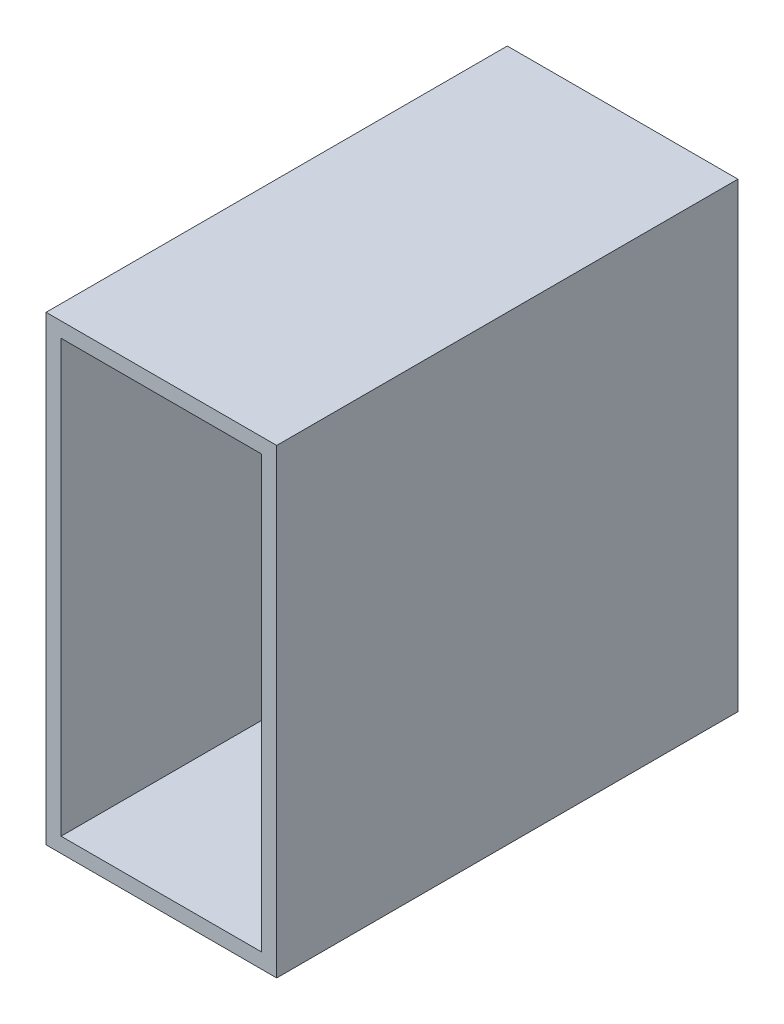
ISO-10303-21;
HEADER;
FILE_DESCRIPTION(('STEP AP214'),'2;1');
FILE_NAME('part.step','',(''),(''),'','','');
FILE_SCHEMA(('AUTOMOTIVE_DESIGN { 1 0 10303 214 1 1 1 1 }'));
ENDSEC;
DATA;
#1=APPLICATION_CONTEXT('core data for automotive mechanical design processes');
#2=APPLICATION_PROTOCOL_DEFINITION('international standard','automotive_design',2000,#1);
#3=PRODUCT_CONTEXT('',#1,'mechanical');
#4=PRODUCT('Part','Part','',(#3));
#5=PRODUCT_RELATED_PRODUCT_CATEGORY('part','',(#4));
#6=PRODUCT_DEFINITION_FORMATION('','',#4);
#7=PRODUCT_DEFINITION_CONTEXT('part definition',#1,'design');
#8=PRODUCT_DEFINITION('design','',#6,#7);
#9=PRODUCT_DEFINITION_SHAPE('','',#8);
#10=(LENGTH_UNIT() NAMED_UNIT(*) SI_UNIT(.MILLI.,.METRE.));
#11=(NAMED_UNIT(*) PLANE_ANGLE_UNIT() SI_UNIT($,.RADIAN.));
#12=(NAMED_UNIT(*) SI_UNIT($,.STERADIAN.) SOLID_ANGLE_UNIT());
#13=UNCERTAINTY_MEASURE_WITH_UNIT(LENGTH_MEASURE(1.E-05),#10,'distance_accuracy_value','');
#14=(GEOMETRIC_REPRESENTATION_CONTEXT(3) GLOBAL_UNCERTAINTY_ASSIGNED_CONTEXT((#13)) GLOBAL_UNIT_ASSIGNED_CONTEXT((#10,
#11,#12)) REPRESENTATION_CONTEXT('',''));
#15=CARTESIAN_POINT('',(0.,0.,0.));
#16=DIRECTION('',(0.,0.,1.));
#17=DIRECTION('',(1.,0.,0.));
#18=AXIS2_PLACEMENT_3D('',#15,#16,#17);
#19=CARTESIAN_POINT('',(-48.4372093023255,-30.1994186046511,50.8));
#20=DIRECTION('',(1.,0.,0.));
#21=DIRECTION('',(0.,0.,-1.));
#22=AXIS2_PLACEMENT_3D('',#19,#20,#21);
#23=PLANE('',#22);
#24=DIRECTION('',(0.,-1.,0.));
#25=VECTOR('',#24,1.);
#26=CARTESIAN_POINT('',(-48.4372093023255,-30.1994186046511,0.));
#27=LINE('',#26,#25);
#28=CARTESIAN_POINT('',(-48.4372093023255,20.6005813953489,0.));
#29=VERTEX_POINT('',#28);
#30=CARTESIAN_POINT('',(-48.4372093023255,-30.1994186046511,0.));
#31=VERTEX_POINT('',#30);
#32=EDGE_CURVE('E130',#29,#31,#27,.T.);
#33=ORIENTED_EDGE('',*,*,#32,.T.);
#34=DIRECTION('',(0.,0.,-1.));
#35=VECTOR('',#34,1.);
#36=CARTESIAN_POINT('',(-48.4372093023255,-30.1994186046511,50.8));
#37=LINE('',#36,#35);
#38=CARTESIAN_POINT('',(-48.4372093023255,-30.1994186046511,50.8));
#39=VERTEX_POINT('',#38);
#40=EDGE_CURVE('E11',#39,#31,#37,.T.);
#41=ORIENTED_EDGE('',*,*,#40,.F.);
#42=DIRECTION('',(0.,-1.,0.));
#43=VECTOR('',#42,1.);
#44=CARTESIAN_POINT('',(-48.4372093023255,-30.1994186046511,50.8));
#45=LINE('',#44,#43);
#46=CARTESIAN_POINT('',(-48.4372093023255,20.6005813953489,50.8));
#47=VERTEX_POINT('',#46);
#48=EDGE_CURVE('E134',#47,#39,#45,.T.);
#49=ORIENTED_EDGE('',*,*,#48,.F.);
#50=DIRECTION('',(0.,0.,-1.));
#51=VECTOR('',#50,1.);
#52=CARTESIAN_POINT('',(-48.4372093023255,20.6005813953489,50.8));
#53=LINE('',#52,#51);
#54=EDGE_CURVE('E144',#47,#29,#53,.T.);
#55=ORIENTED_EDGE('',*,*,#54,.T.);
#56=EDGE_LOOP('',(#33,#41,#49,#55));
#57=FACE_BOUND('',#56,.T.);
#58=ADVANCED_FACE('F33',(#57),#23,.F.);
#59=CARTESIAN_POINT('',(-48.4372093023255,-30.1994186046511,50.8));
#60=DIRECTION('',(0.,1.,0.));
#61=DIRECTION('',(0.,0.,1.));
#62=AXIS2_PLACEMENT_3D('',#59,#60,#61);
#63=PLANE('',#62);
#64=DIRECTION('',(1.,0.,0.));
#65=VECTOR('',#64,1.);
#66=CARTESIAN_POINT('',(-48.4372093023255,-30.1994186046511,0.));
#67=LINE('',#66,#65);
#68=CARTESIAN_POINT('',(-23.0372093023255,-30.1994186046511,0.));
#69=VERTEX_POINT('',#68);
#70=EDGE_CURVE('E147',#31,#69,#67,.T.);
#71=ORIENTED_EDGE('',*,*,#70,.T.);
#72=DIRECTION('',(0.,0.,-1.));
#73=VECTOR('',#72,1.);
#74=CARTESIAN_POINT('',(-23.0372093023255,-30.1994186046511,50.8));
#75=LINE('',#74,#73);
#76=CARTESIAN_POINT('',(-23.0372093023255,-30.1994186046511,50.8));
#77=VERTEX_POINT('',#76);
#78=EDGE_CURVE('E40',#77,#69,#75,.T.);
#79=ORIENTED_EDGE('',*,*,#78,.F.);
#80=DIRECTION('',(1.,0.,0.));
#81=VECTOR('',#80,1.);
#82=CARTESIAN_POINT('',(-48.4372093023255,-30.1994186046511,50.8));
#83=LINE('',#82,#81);
#84=EDGE_CURVE('E137',#39,#77,#83,.T.);
#85=ORIENTED_EDGE('',*,*,#84,.F.);
#86=ORIENTED_EDGE('',*,*,#40,.T.);
#87=EDGE_LOOP('',(#71,#79,#85,#86));
#88=FACE_BOUND('',#87,.T.);
#89=ADVANCED_FACE('F175',(#88),#63,.F.);
#90=CARTESIAN_POINT('',(-23.0372093023255,-30.1994186046511,50.8));
#91=DIRECTION('',(-1.,0.,0.));
#92=DIRECTION('',(0.,-1.,0.));
#93=AXIS2_PLACEMENT_3D('',#90,#91,#92);
#94=PLANE('',#93);
#95=DIRECTION('',(0.,1.,0.));
#96=VECTOR('',#95,1.);
#97=CARTESIAN_POINT('',(-23.0372093023255,-30.1994186046511,0.));
#98=LINE('',#97,#96);
#99=CARTESIAN_POINT('',(-23.0372093023255,20.6005813953489,0.));
#100=VERTEX_POINT('',#99);
#101=EDGE_CURVE('E149',#69,#100,#98,.T.);
#102=ORIENTED_EDGE('',*,*,#101,.T.);
#103=DIRECTION('',(0.,0.,-1.));
#104=VECTOR('',#103,1.);
#105=CARTESIAN_POINT('',(-23.0372093023255,20.6005813953489,50.8));
#106=LINE('',#105,#104);
#107=CARTESIAN_POINT('',(-23.0372093023255,20.6005813953489,50.8));
#108=VERTEX_POINT('',#107);
#109=EDGE_CURVE('E154',#108,#100,#106,.T.);
#110=ORIENTED_EDGE('',*,*,#109,.F.);
#111=DIRECTION('',(0.,1.,0.));
#112=VECTOR('',#111,1.);
#113=CARTESIAN_POINT('',(-23.0372093023255,-30.1994186046511,50.8));
#114=LINE('',#113,#112);
#115=EDGE_CURVE('E140',#77,#108,#114,.T.);
#116=ORIENTED_EDGE('',*,*,#115,.F.);
#117=ORIENTED_EDGE('',*,*,#78,.T.);
#118=EDGE_LOOP('',(#102,#110,#116,#117));
#119=FACE_BOUND('',#118,.T.);
#120=ADVANCED_FACE('F161',(#119),#94,.F.);
#121=CARTESIAN_POINT('',(-48.4372093023255,20.6005813953489,50.8));
#122=DIRECTION('',(0.,-1.,0.));
#123=DIRECTION('',(0.,0.,-1.));
#124=AXIS2_PLACEMENT_3D('',#121,#122,#123);
#125=PLANE('',#124);
#126=DIRECTION('',(-1.,0.,0.));
#127=VECTOR('',#126,1.);
#128=CARTESIAN_POINT('',(-48.4372093023255,20.6005813953489,0.));
#129=LINE('',#128,#127);
#130=EDGE_CURVE('E138',#100,#29,#129,.T.);
#131=ORIENTED_EDGE('',*,*,#130,.T.);
#132=ORIENTED_EDGE('',*,*,#54,.F.);
#133=DIRECTION('',(-1.,0.,0.));
#134=VECTOR('',#133,1.);
#135=CARTESIAN_POINT('',(-48.4372093023255,20.6005813953489,50.8));
#136=LINE('',#135,#134);
#137=EDGE_CURVE('E142',#108,#47,#136,.T.);
#138=ORIENTED_EDGE('',*,*,#137,.F.);
#139=ORIENTED_EDGE('',*,*,#109,.T.);
#140=EDGE_LOOP('',(#131,#132,#138,#139));
#141=FACE_BOUND('',#140,.T.);
#142=ADVANCED_FACE('F168',(#141),#125,.F.);
#143=CARTESIAN_POINT('',(0.,0.,50.8));
#144=DIRECTION('',(0.,0.,-1.));
#145=DIRECTION('',(-1.,0.,0.));
#146=AXIS2_PLACEMENT_3D('',#143,#144,#145);
#147=PLANE('',#146);
#148=DIRECTION('',(-1.,0.,0.));
#149=VECTOR('',#148,1.);
#150=CARTESIAN_POINT('',(-46.7862093023255,18.9495813953489,50.8));
#151=LINE('',#150,#149);
#152=CARTESIAN_POINT('',(-24.6882093023255,18.9495813953489,50.8));
#153=VERTEX_POINT('',#152);
#154=CARTESIAN_POINT('',(-46.7862093023255,18.9495813953489,50.8));
#155=VERTEX_POINT('',#154);
#156=EDGE_CURVE('E124',#153,#155,#151,.T.);
#157=ORIENTED_EDGE('',*,*,#156,.F.);
#158=DIRECTION('',(0.,1.,0.));
#159=VECTOR('',#158,1.);
#160=CARTESIAN_POINT('',(-24.6882093023255,18.9495813953489,50.8));
#161=LINE('',#160,#159);
#162=CARTESIAN_POINT('',(-24.6882093023255,-28.5484186046511,50.8));
#163=VERTEX_POINT('',#162);
#164=EDGE_CURVE('E47',#163,#153,#161,.T.);
#165=ORIENTED_EDGE('',*,*,#164,.F.);
#166=DIRECTION('',(1.,0.,0.));
#167=VECTOR('',#166,1.);
#168=CARTESIAN_POINT('',(-46.7862093023255,-28.5484186046511,50.8));
#169=LINE('',#168,#167);
#170=CARTESIAN_POINT('',(-46.7862093023255,-28.5484186046511,50.8));
#171=VERTEX_POINT('',#170);
#172=EDGE_CURVE('E115',#171,#163,#169,.T.);
#173=ORIENTED_EDGE('',*,*,#172,.F.);
#174=DIRECTION('',(0.,-1.,0.));
#175=VECTOR('',#174,1.);
#176=CARTESIAN_POINT('',(-46.7862093023255,18.9495813953489,50.8));
#177=LINE('',#176,#175);
#178=EDGE_CURVE('E118',#155,#171,#177,.T.);
#179=ORIENTED_EDGE('',*,*,#178,.F.);
#180=EDGE_LOOP('',(#157,#165,#173,#179));
#181=FACE_BOUND('',#180,.T.);
#182=ORIENTED_EDGE('',*,*,#48,.T.);
#183=ORIENTED_EDGE('',*,*,#84,.T.);
#184=ORIENTED_EDGE('',*,*,#115,.T.);
#185=ORIENTED_EDGE('',*,*,#137,.T.);
#186=EDGE_LOOP('',(#182,#183,#184,#185));
#187=FACE_BOUND('',#186,.T.);
#188=ADVANCED_FACE('F174',(#181,#187),#147,.F.);
#189=CARTESIAN_POINT('',(0.,0.,0.));
#190=DIRECTION('',(0.,0.,-1.));
#191=DIRECTION('',(-1.,0.,0.));
#192=AXIS2_PLACEMENT_3D('',#189,#190,#191);
#193=PLANE('',#192);
#194=DIRECTION('',(0.,1.,0.));
#195=VECTOR('',#194,1.);
#196=CARTESIAN_POINT('',(-24.6882093023255,18.9495813953489,0.));
#197=LINE('',#196,#195);
#198=CARTESIAN_POINT('',(-24.6882093023255,-28.5484186046511,0.));
#199=VERTEX_POINT('',#198);
#200=CARTESIAN_POINT('',(-24.6882093023255,18.9495813953489,0.));
#201=VERTEX_POINT('',#200);
#202=EDGE_CURVE('E99',#199,#201,#197,.T.);
#203=ORIENTED_EDGE('',*,*,#202,.T.);
#204=DIRECTION('',(-1.,0.,0.));
#205=VECTOR('',#204,1.);
#206=CARTESIAN_POINT('',(-46.7862093023255,18.9495813953489,0.));
#207=LINE('',#206,#205);
#208=CARTESIAN_POINT('',(-46.7862093023255,18.9495813953489,0.));
#209=VERTEX_POINT('',#208);
#210=EDGE_CURVE('E108',#201,#209,#207,.T.);
#211=ORIENTED_EDGE('',*,*,#210,.T.);
#212=DIRECTION('',(0.,-1.,0.));
#213=VECTOR('',#212,1.);
#214=CARTESIAN_POINT('',(-46.7862093023255,18.9495813953489,0.));
#215=LINE('',#214,#213);
#216=CARTESIAN_POINT('',(-46.7862093023255,-28.5484186046511,0.));
#217=VERTEX_POINT('',#216);
#218=EDGE_CURVE('E55',#209,#217,#215,.T.);
#219=ORIENTED_EDGE('',*,*,#218,.T.);
#220=DIRECTION('',(1.,0.,0.));
#221=VECTOR('',#220,1.);
#222=CARTESIAN_POINT('',(-46.7862093023255,-28.5484186046511,0.));
#223=LINE('',#222,#221);
#224=EDGE_CURVE('E105',#217,#199,#223,.T.);
#225=ORIENTED_EDGE('',*,*,#224,.T.);
#226=EDGE_LOOP('',(#203,#211,#219,#225));
#227=FACE_BOUND('',#226,.T.);
#228=ORIENTED_EDGE('',*,*,#32,.F.);
#229=ORIENTED_EDGE('',*,*,#130,.F.);
#230=ORIENTED_EDGE('',*,*,#101,.F.);
#231=ORIENTED_EDGE('',*,*,#70,.F.);
#232=EDGE_LOOP('',(#228,#229,#230,#231));
#233=FACE_BOUND('',#232,.T.);
#234=ADVANCED_FACE('F112',(#227,#233),#193,.T.);
#235=CARTESIAN_POINT('',(-24.6882093023255,18.9495813953489,0.));
#236=DIRECTION('',(1.,0.,0.));
#237=DIRECTION('',(0.,1.,0.));
#238=AXIS2_PLACEMENT_3D('',#235,#236,#237);
#239=PLANE('',#238);
#240=ORIENTED_EDGE('',*,*,#164,.T.);
#241=DIRECTION('',(0.,0.,1.));
#242=VECTOR('',#241,1.);
#243=CARTESIAN_POINT('',(-24.6882093023255,18.9495813953489,0.));
#244=LINE('',#243,#242);
#245=EDGE_CURVE('E95',#201,#153,#244,.T.);
#246=ORIENTED_EDGE('',*,*,#245,.F.);
#247=ORIENTED_EDGE('',*,*,#202,.F.);
#248=DIRECTION('',(0.,0.,1.));
#249=VECTOR('',#248,1.);
#250=CARTESIAN_POINT('',(-24.6882093023255,-28.5484186046511,0.));
#251=LINE('',#250,#249);
#252=EDGE_CURVE('E128',#199,#163,#251,.T.);
#253=ORIENTED_EDGE('',*,*,#252,.T.);
#254=EDGE_LOOP('',(#240,#246,#247,#253));
#255=FACE_BOUND('',#254,.T.);
#256=ADVANCED_FACE('F97',(#255),#239,.F.);
#257=CARTESIAN_POINT('',(-46.7862093023255,-28.5484186046511,0.));
#258=DIRECTION('',(0.,-1.,0.));
#259=DIRECTION('',(0.,0.,-1.));
#260=AXIS2_PLACEMENT_3D('',#257,#258,#259);
#261=PLANE('',#260);
#262=ORIENTED_EDGE('',*,*,#172,.T.);
#263=ORIENTED_EDGE('',*,*,#252,.F.);
#264=ORIENTED_EDGE('',*,*,#224,.F.);
#265=DIRECTION('',(0.,0.,1.));
#266=VECTOR('',#265,1.);
#267=CARTESIAN_POINT('',(-46.7862093023255,-28.5484186046511,0.));
#268=LINE('',#267,#266);
#269=EDGE_CURVE('E131',#217,#171,#268,.T.);
#270=ORIENTED_EDGE('',*,*,#269,.T.);
#271=EDGE_LOOP('',(#262,#263,#264,#270));
#272=FACE_BOUND('',#271,.T.);
#273=ADVANCED_FACE('F192',(#272),#261,.F.);
#274=CARTESIAN_POINT('',(-46.7862093023255,18.9495813953489,0.));
#275=DIRECTION('',(-1.,0.,0.));
#276=DIRECTION('',(0.,-1.,0.));
#277=AXIS2_PLACEMENT_3D('',#274,#275,#276);
#278=PLANE('',#277);
#279=ORIENTED_EDGE('',*,*,#178,.T.);
#280=ORIENTED_EDGE('',*,*,#269,.F.);
#281=ORIENTED_EDGE('',*,*,#218,.F.);
#282=DIRECTION('',(0.,0.,1.));
#283=VECTOR('',#282,1.);
#284=CARTESIAN_POINT('',(-46.7862093023255,18.9495813953489,0.));
#285=LINE('',#284,#283);
#286=EDGE_CURVE('E104',#209,#155,#285,.T.);
#287=ORIENTED_EDGE('',*,*,#286,.T.);
#288=EDGE_LOOP('',(#279,#280,#281,#287));
#289=FACE_BOUND('',#288,.T.);
#290=ADVANCED_FACE('F195',(#289),#278,.F.);
#291=CARTESIAN_POINT('',(-46.7862093023255,18.9495813953489,0.));
#292=DIRECTION('',(0.,1.,0.));
#293=DIRECTION('',(0.,0.,1.));
#294=AXIS2_PLACEMENT_3D('',#291,#292,#293);
#295=PLANE('',#294);
#296=ORIENTED_EDGE('',*,*,#156,.T.);
#297=ORIENTED_EDGE('',*,*,#286,.F.);
#298=ORIENTED_EDGE('',*,*,#210,.F.);
#299=ORIENTED_EDGE('',*,*,#245,.T.);
#300=EDGE_LOOP('',(#296,#297,#298,#299));
#301=FACE_BOUND('',#300,.T.);
#302=ADVANCED_FACE('F109',(#301),#295,.F.);
#303=CLOSED_SHELL('',(#58,#89,#120,#142,#188,#234,#256,#273,#290,#302));
#304=MANIFOLD_SOLID_BREP('B2',#303);
#305=ADVANCED_BREP_SHAPE_REPRESENTATION('',(#18,#304),#14);
#306=SHAPE_DEFINITION_REPRESENTATION(#9,#305);
ENDSEC;
END-ISO-10303-21;
